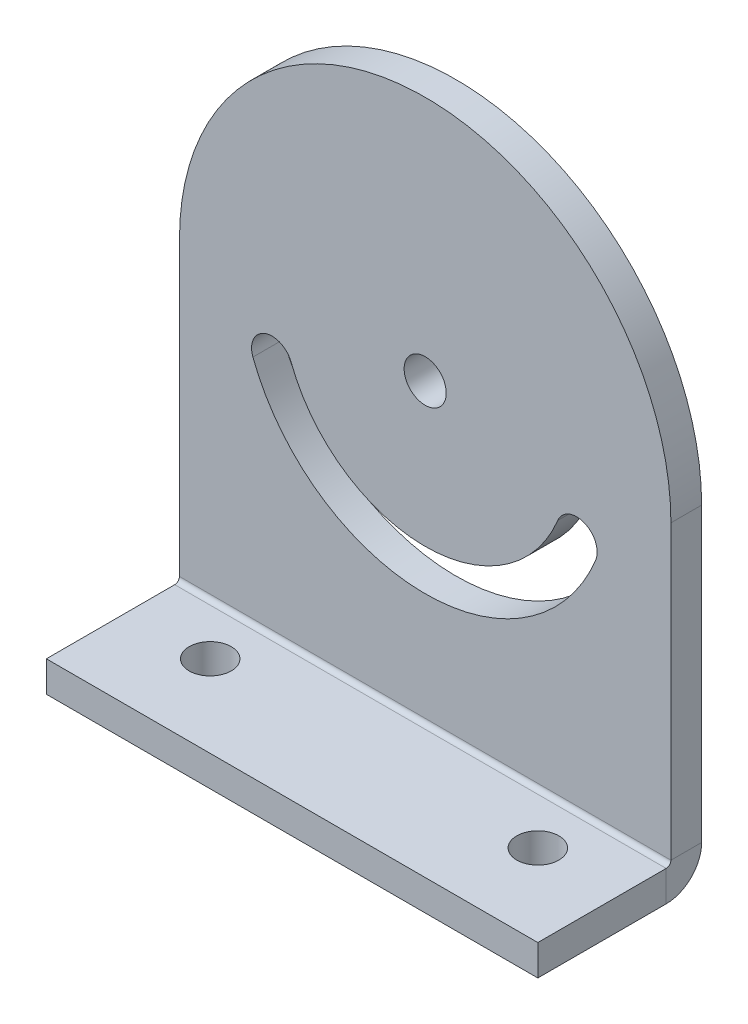
ISO-10303-21;
HEADER;
FILE_DESCRIPTION(('STEP AP214'),'2;1');
FILE_NAME('part.step','',(''),(''),'','','');
FILE_SCHEMA(('AUTOMOTIVE_DESIGN { 1 0 10303 214 1 1 1 1 }'));
ENDSEC;
DATA;
#1=APPLICATION_CONTEXT('core data for automotive mechanical design processes');
#2=APPLICATION_PROTOCOL_DEFINITION('international standard','automotive_design',2000,#1);
#3=PRODUCT_CONTEXT('',#1,'mechanical');
#4=PRODUCT('Part','Part','',(#3));
#5=PRODUCT_RELATED_PRODUCT_CATEGORY('part','',(#4));
#6=PRODUCT_DEFINITION_FORMATION('','',#4);
#7=PRODUCT_DEFINITION_CONTEXT('part definition',#1,'design');
#8=PRODUCT_DEFINITION('design','',#6,#7);
#9=PRODUCT_DEFINITION_SHAPE('','',#8);
#10=(LENGTH_UNIT() NAMED_UNIT(*) SI_UNIT(.MILLI.,.METRE.));
#11=(NAMED_UNIT(*) PLANE_ANGLE_UNIT() SI_UNIT($,.RADIAN.));
#12=(NAMED_UNIT(*) SI_UNIT($,.STERADIAN.) SOLID_ANGLE_UNIT());
#13=UNCERTAINTY_MEASURE_WITH_UNIT(LENGTH_MEASURE(1.E-05),#10,'distance_accuracy_value','');
#14=(GEOMETRIC_REPRESENTATION_CONTEXT(3) GLOBAL_UNCERTAINTY_ASSIGNED_CONTEXT((#13)) GLOBAL_UNIT_ASSIGNED_CONTEXT((#10,
#11,#12)) REPRESENTATION_CONTEXT('',''));
#15=CARTESIAN_POINT('',(0.,0.,0.));
#16=DIRECTION('',(0.,0.,1.));
#17=DIRECTION('',(1.,0.,0.));
#18=AXIS2_PLACEMENT_3D('',#15,#16,#17);
#19=CARTESIAN_POINT('',(0.,0.,-4.7625));
#20=DIRECTION('',(1.,0.,0.));
#21=DIRECTION('',(0.,1.,0.));
#22=AXIS2_PLACEMENT_3D('',#19,#20,#21);
#23=PLANE('',#22);
#24=DIRECTION('',(0.,1.,0.));
#25=VECTOR('',#24,1.);
#26=CARTESIAN_POINT('',(0.,0.,0.));
#27=LINE('',#26,#25);
#28=CARTESIAN_POINT('',(0.,-45.3009,0.));
#29=VERTEX_POINT('',#28);
#30=CARTESIAN_POINT('',(0.,0.,0.));
#31=VERTEX_POINT('',#30);
#32=EDGE_CURVE('E260',#29,#31,#27,.T.);
#33=ORIENTED_EDGE('',*,*,#32,.F.);
#34=DIRECTION('',(0.,0.,-1.));
#35=VECTOR('',#34,1.);
#36=CARTESIAN_POINT('',(0.,-45.3009,0.));
#37=LINE('',#36,#35);
#38=CARTESIAN_POINT('',(0.,-45.3009,-4.76250000000001));
#39=VERTEX_POINT('',#38);
#40=EDGE_CURVE('E239',#29,#39,#37,.T.);
#41=ORIENTED_EDGE('',*,*,#40,.T.);
#42=DIRECTION('',(0.,1.,0.));
#43=VECTOR('',#42,1.);
#44=CARTESIAN_POINT('',(0.,0.,-4.7625));
#45=LINE('',#44,#43);
#46=CARTESIAN_POINT('',(0.,0.,-4.7625));
#47=VERTEX_POINT('',#46);
#48=EDGE_CURVE('E263',#39,#47,#45,.T.);
#49=ORIENTED_EDGE('',*,*,#48,.T.);
#50=DIRECTION('',(0.,0.,1.));
#51=VECTOR('',#50,1.);
#52=CARTESIAN_POINT('',(0.,0.,-4.7625));
#53=LINE('',#52,#51);
#54=EDGE_CURVE('E13',#47,#31,#53,.T.);
#55=ORIENTED_EDGE('',*,*,#54,.T.);
#56=EDGE_LOOP('',(#33,#41,#49,#55));
#57=FACE_BOUND('',#56,.T.);
#58=ADVANCED_FACE('F59',(#57),#23,.T.);
#59=CARTESIAN_POINT('',(-38.1,0.,-4.7625));
#60=DIRECTION('',(0.,0.,1.));
#61=DIRECTION('',(1.,0.,0.));
#62=AXIS2_PLACEMENT_3D('',#59,#60,#61);
#63=PLANE('',#62);
#64=CARTESIAN_POINT('',(-38.1,0.,-4.76250000000001));
#65=DIRECTION('',(0.,0.,-1.));
#66=DIRECTION('',(1.,0.,0.));
#67=AXIS2_PLACEMENT_3D('',#64,#65,#66);
#68=CIRCLE('',#67,22.225);
#69=CARTESIAN_POINT('',(-17.5464100212601,-8.45580061176,-4.76250000000001));
#70=VERTEX_POINT('',#69);
#71=CARTESIAN_POINT('',(-58.8758877781445,-7.89386546819408,-4.76250000000001));
#72=VERTEX_POINT('',#71);
#73=EDGE_CURVE('E156',#70,#72,#68,.T.);
#74=ORIENTED_EDGE('',*,*,#73,.T.);
#75=CARTESIAN_POINT('',(-61.8438717464508,-9.02156053507896,-4.76250000000001));
#76=DIRECTION('',(0.,0.,1.));
#77=DIRECTION('',(1.,0.,0.));
#78=AXIS2_PLACEMENT_3D('',#75,#76,#77);
#79=CIRCLE('',#78,3.17500000000001);
#80=CARTESIAN_POINT('',(-64.8118557147572,-10.1492556019638,-4.76250000000001));
#81=VERTEX_POINT('',#80);
#82=EDGE_CURVE('E150',#72,#81,#79,.T.);
#83=ORIENTED_EDGE('',*,*,#82,.T.);
#84=CARTESIAN_POINT('',(-38.1,0.,-4.76250000000001));
#85=DIRECTION('',(0.,0.,1.));
#86=DIRECTION('',(1.,0.,0.));
#87=AXIS2_PLACEMENT_3D('',#84,#85,#86);
#88=CIRCLE('',#87,28.575);
#89=CARTESIAN_POINT('',(-11.6739557416201,-10.8717436436914,-4.7625));
#90=VERTEX_POINT('',#89);
#91=EDGE_CURVE('E159',#81,#90,#88,.T.);
#92=ORIENTED_EDGE('',*,*,#91,.T.);
#93=CARTESIAN_POINT('',(-14.6101828814401,-9.66377212772572,-4.76250000000001));
#94=DIRECTION('',(0.,0.,1.));
#95=DIRECTION('',(1.,0.,0.));
#96=AXIS2_PLACEMENT_3D('',#93,#94,#95);
#97=CIRCLE('',#96,3.175);
#98=EDGE_CURVE('E74',#90,#70,#97,.T.);
#99=ORIENTED_EDGE('',*,*,#98,.T.);
#100=EDGE_LOOP('',(#74,#83,#92,#99));
#101=FACE_BOUND('',#100,.T.);
#102=CARTESIAN_POINT('',(-38.1,0.,-4.7625));
#103=DIRECTION('',(0.,0.,1.));
#104=DIRECTION('',(1.,0.,0.));
#105=AXIS2_PLACEMENT_3D('',#102,#103,#104);
#106=CIRCLE('',#105,3.2639);
#107=CARTESIAN_POINT('',(-34.8361,0.,-4.7625));
#108=VERTEX_POINT('',#107);
#109=EDGE_CURVE('E187',#108,#108,#106,.T.);
#110=ORIENTED_EDGE('',*,*,#109,.T.);
#111=EDGE_LOOP('',(#110));
#112=FACE_BOUND('',#111,.T.);
#113=DIRECTION('',(1.,0.,0.));
#114=VECTOR('',#113,1.);
#115=CARTESIAN_POINT('',(0.,-45.3009,-4.76250000000001));
#116=LINE('',#115,#114);
#117=CARTESIAN_POINT('',(-76.2,-45.3009,-4.7625));
#118=VERTEX_POINT('',#117);
#119=EDGE_CURVE('E233',#39,#118,#116,.F.);
#120=ORIENTED_EDGE('',*,*,#119,.T.);
#121=DIRECTION('',(0.,-1.,0.));
#122=VECTOR('',#121,1.);
#123=CARTESIAN_POINT('',(-76.2,-50.8,-4.7625));
#124=LINE('',#123,#122);
#125=CARTESIAN_POINT('',(-76.2,0.,-4.7625));
#126=VERTEX_POINT('',#125);
#127=EDGE_CURVE('E259',#126,#118,#124,.T.);
#128=ORIENTED_EDGE('',*,*,#127,.F.);
#129=CARTESIAN_POINT('',(-38.1,0.,-4.7625));
#130=DIRECTION('',(0.,0.,1.));
#131=DIRECTION('',(1.,0.,0.));
#132=AXIS2_PLACEMENT_3D('',#129,#130,#131);
#133=CIRCLE('',#132,38.1);
#134=EDGE_CURVE('E256',#47,#126,#133,.T.);
#135=ORIENTED_EDGE('',*,*,#134,.F.);
#136=ORIENTED_EDGE('',*,*,#48,.F.);
#137=EDGE_LOOP('',(#120,#128,#135,#136));
#138=FACE_BOUND('',#137,.T.);
#139=ADVANCED_FACE('F163',(#101,#112,#138),#63,.F.);
#140=CARTESIAN_POINT('',(-38.1,0.,0.));
#141=DIRECTION('',(0.,0.,1.));
#142=DIRECTION('',(1.,0.,0.));
#143=AXIS2_PLACEMENT_3D('',#140,#141,#142);
#144=PLANE('',#143);
#145=CARTESIAN_POINT('',(-61.8438717464508,-9.02156053507896,0.));
#146=DIRECTION('',(0.,0.,1.));
#147=DIRECTION('',(1.,0.,0.));
#148=AXIS2_PLACEMENT_3D('',#145,#146,#147);
#149=CIRCLE('',#148,3.17500000000001);
#150=CARTESIAN_POINT('',(-58.8758877781445,-7.89386546819408,0.));
#151=VERTEX_POINT('',#150);
#152=CARTESIAN_POINT('',(-64.8118557147572,-10.1492556019638,0.));
#153=VERTEX_POINT('',#152);
#154=EDGE_CURVE('E82',#151,#153,#149,.T.);
#155=ORIENTED_EDGE('',*,*,#154,.F.);
#156=CARTESIAN_POINT('',(-38.1,0.,0.));
#157=DIRECTION('',(0.,0.,-1.));
#158=DIRECTION('',(1.,0.,0.));
#159=AXIS2_PLACEMENT_3D('',#156,#157,#158);
#160=CIRCLE('',#159,22.225);
#161=CARTESIAN_POINT('',(-17.5464100212601,-8.45580061176,0.));
#162=VERTEX_POINT('',#161);
#163=EDGE_CURVE('E166',#162,#151,#160,.T.);
#164=ORIENTED_EDGE('',*,*,#163,.F.);
#165=CARTESIAN_POINT('',(-14.6101828814401,-9.66377212772572,0.));
#166=DIRECTION('',(0.,0.,1.));
#167=DIRECTION('',(1.,0.,0.));
#168=AXIS2_PLACEMENT_3D('',#165,#166,#167);
#169=CIRCLE('',#168,3.175);
#170=CARTESIAN_POINT('',(-11.6739557416201,-10.8717436436914,0.));
#171=VERTEX_POINT('',#170);
#172=EDGE_CURVE('E169',#171,#162,#169,.T.);
#173=ORIENTED_EDGE('',*,*,#172,.F.);
#174=CARTESIAN_POINT('',(-38.1,0.,0.));
#175=DIRECTION('',(0.,0.,1.));
#176=DIRECTION('',(1.,0.,0.));
#177=AXIS2_PLACEMENT_3D('',#174,#175,#176);
#178=CIRCLE('',#177,28.575);
#179=EDGE_CURVE('E175',#153,#171,#178,.T.);
#180=ORIENTED_EDGE('',*,*,#179,.F.);
#181=EDGE_LOOP('',(#155,#164,#173,#180));
#182=FACE_BOUND('',#181,.T.);
#183=CARTESIAN_POINT('',(-38.1,0.,0.));
#184=DIRECTION('',(0.,0.,1.));
#185=DIRECTION('',(1.,0.,0.));
#186=AXIS2_PLACEMENT_3D('',#183,#184,#185);
#187=CIRCLE('',#186,3.26389999999999);
#188=CARTESIAN_POINT('',(-34.8361,0.,0.));
#189=VERTEX_POINT('',#188);
#190=EDGE_CURVE('E181',#189,#189,#187,.T.);
#191=ORIENTED_EDGE('',*,*,#190,.F.);
#192=EDGE_LOOP('',(#191));
#193=FACE_BOUND('',#192,.T.);
#194=DIRECTION('',(0.,-1.,0.));
#195=VECTOR('',#194,1.);
#196=CARTESIAN_POINT('',(-76.2,-50.8,0.));
#197=LINE('',#196,#195);
#198=CARTESIAN_POINT('',(-76.2,0.,0.));
#199=VERTEX_POINT('',#198);
#200=CARTESIAN_POINT('',(-76.2,-45.3009,0.));
#201=VERTEX_POINT('',#200);
#202=EDGE_CURVE('E267',#199,#201,#197,.T.);
#203=ORIENTED_EDGE('',*,*,#202,.T.);
#204=DIRECTION('',(1.,0.,0.));
#205=VECTOR('',#204,1.);
#206=CARTESIAN_POINT('',(0.,-45.3009,0.));
#207=LINE('',#206,#205);
#208=EDGE_CURVE('E245',#29,#201,#207,.F.);
#209=ORIENTED_EDGE('',*,*,#208,.F.);
#210=ORIENTED_EDGE('',*,*,#32,.T.);
#211=CARTESIAN_POINT('',(-38.1,0.,0.));
#212=DIRECTION('',(0.,0.,1.));
#213=DIRECTION('',(1.,0.,0.));
#214=AXIS2_PLACEMENT_3D('',#211,#212,#213);
#215=CIRCLE('',#214,38.1);
#216=EDGE_CURVE('E253',#31,#199,#215,.T.);
#217=ORIENTED_EDGE('',*,*,#216,.T.);
#218=EDGE_LOOP('',(#203,#209,#210,#217));
#219=FACE_BOUND('',#218,.T.);
#220=ADVANCED_FACE('F272',(#182,#193,#219),#144,.T.);
#221=CARTESIAN_POINT('',(-38.1,0.,-4.7625));
#222=DIRECTION('',(0.,0.,1.));
#223=DIRECTION('',(1.,0.,0.));
#224=AXIS2_PLACEMENT_3D('',#221,#222,#223);
#225=CYLINDRICAL_SURFACE('',#224,38.1);
#226=ORIENTED_EDGE('',*,*,#216,.F.);
#227=ORIENTED_EDGE('',*,*,#54,.F.);
#228=ORIENTED_EDGE('',*,*,#134,.T.);
#229=DIRECTION('',(0.,0.,1.));
#230=VECTOR('',#229,1.);
#231=CARTESIAN_POINT('',(-76.2,0.,-4.7625));
#232=LINE('',#231,#230);
#233=EDGE_CURVE('E63',#126,#199,#232,.T.);
#234=ORIENTED_EDGE('',*,*,#233,.T.);
#235=EDGE_LOOP('',(#226,#227,#228,#234));
#236=FACE_BOUND('',#235,.T.);
#237=ADVANCED_FACE('F61',(#236),#225,.T.);
#238=CARTESIAN_POINT('',(-76.2,-50.8,-4.7625));
#239=DIRECTION('',(-1.,0.,0.));
#240=DIRECTION('',(0.,-1.,0.));
#241=AXIS2_PLACEMENT_3D('',#238,#239,#240);
#242=PLANE('',#241);
#243=DIRECTION('',(0.,0.,-1.));
#244=VECTOR('',#243,1.);
#245=CARTESIAN_POINT('',(-76.2,-45.3009,0.));
#246=LINE('',#245,#244);
#247=EDGE_CURVE('E250',#201,#118,#246,.T.);
#248=ORIENTED_EDGE('',*,*,#247,.F.);
#249=ORIENTED_EDGE('',*,*,#202,.F.);
#250=ORIENTED_EDGE('',*,*,#233,.F.);
#251=ORIENTED_EDGE('',*,*,#127,.T.);
#252=EDGE_LOOP('',(#248,#249,#250,#251));
#253=FACE_BOUND('',#252,.T.);
#254=ADVANCED_FACE('F282',(#253),#242,.T.);
#255=CARTESIAN_POINT('',(-76.2,-45.3009,0.7366));
#256=DIRECTION('',(-1.,0.,0.));
#257=DIRECTION('',(0.,0.,1.));
#258=AXIS2_PLACEMENT_3D('',#255,#256,#257);
#259=PLANE('',#258);
#260=DIRECTION('',(0.,1.,0.));
#261=VECTOR('',#260,1.);
#262=CARTESIAN_POINT('',(-76.2,-50.8,0.736599999999981));
#263=LINE('',#262,#261);
#264=CARTESIAN_POINT('',(-76.2,-46.0375,0.736599999999997));
#265=VERTEX_POINT('',#264);
#266=CARTESIAN_POINT('',(-76.2,-50.8,0.736599999999981));
#267=VERTEX_POINT('',#266);
#268=EDGE_CURVE('E202',#265,#267,#263,.F.);
#269=ORIENTED_EDGE('',*,*,#268,.F.);
#270=CARTESIAN_POINT('',(-76.2,-45.3009,0.7366));
#271=DIRECTION('',(1.,0.,0.));
#272=DIRECTION('',(0.,0.,-1.));
#273=AXIS2_PLACEMENT_3D('',#270,#271,#272);
#274=CIRCLE('',#273,0.736600000000011);
#275=EDGE_CURVE('E242',#201,#265,#274,.F.);
#276=ORIENTED_EDGE('',*,*,#275,.F.);
#277=ORIENTED_EDGE('',*,*,#247,.T.);
#278=CARTESIAN_POINT('',(-76.2,-45.3009,0.7366));
#279=DIRECTION('',(1.,0.,0.));
#280=DIRECTION('',(0.,0.,-1.));
#281=AXIS2_PLACEMENT_3D('',#278,#279,#280);
#282=CIRCLE('',#281,5.49910000000001);
#283=EDGE_CURVE('E235',#118,#267,#282,.F.);
#284=ORIENTED_EDGE('',*,*,#283,.T.);
#285=EDGE_LOOP('',(#269,#276,#277,#284));
#286=FACE_BOUND('',#285,.T.);
#287=ADVANCED_FACE('F289',(#286),#259,.T.);
#288=CARTESIAN_POINT('',(0.,-45.3009,0.736600000000006));
#289=DIRECTION('',(-1.,0.,0.));
#290=DIRECTION('',(0.,0.,1.));
#291=AXIS2_PLACEMENT_3D('',#288,#289,#290);
#292=PLANE('',#291);
#293=CARTESIAN_POINT('',(0.,-45.3009,0.736600000000006));
#294=DIRECTION('',(1.,0.,0.));
#295=DIRECTION('',(0.,0.,-1.));
#296=AXIS2_PLACEMENT_3D('',#293,#294,#295);
#297=CIRCLE('',#296,0.736600000000011);
#298=CARTESIAN_POINT('',(0.,-46.0375,0.736600000000003));
#299=VERTEX_POINT('',#298);
#300=EDGE_CURVE('E206',#299,#29,#297,.T.);
#301=ORIENTED_EDGE('',*,*,#300,.F.);
#302=DIRECTION('',(0.,1.,0.));
#303=VECTOR('',#302,1.);
#304=CARTESIAN_POINT('',(0.,-46.0375,0.736600000000004));
#305=LINE('',#304,#303);
#306=CARTESIAN_POINT('',(0.,-50.8,0.736599999999988));
#307=VERTEX_POINT('',#306);
#308=EDGE_CURVE('E226',#299,#307,#305,.F.);
#309=ORIENTED_EDGE('',*,*,#308,.T.);
#310=CARTESIAN_POINT('',(0.,-45.3009,0.736600000000006));
#311=DIRECTION('',(1.,0.,0.));
#312=DIRECTION('',(0.,0.,-1.));
#313=AXIS2_PLACEMENT_3D('',#310,#311,#312);
#314=CIRCLE('',#313,5.49910000000001);
#315=EDGE_CURVE('E236',#307,#39,#314,.T.);
#316=ORIENTED_EDGE('',*,*,#315,.T.);
#317=ORIENTED_EDGE('',*,*,#40,.F.);
#318=EDGE_LOOP('',(#301,#309,#316,#317));
#319=FACE_BOUND('',#318,.T.);
#320=ADVANCED_FACE('F310',(#319),#292,.F.);
#321=CARTESIAN_POINT('',(0.,-45.3009,0.736600000000006));
#322=DIRECTION('',(1.,0.,0.));
#323=DIRECTION('',(0.,-1.,0.));
#324=AXIS2_PLACEMENT_3D('',#321,#322,#323);
#325=CYLINDRICAL_SURFACE('',#324,5.49910000000001);
#326=ORIENTED_EDGE('',*,*,#119,.F.);
#327=ORIENTED_EDGE('',*,*,#315,.F.);
#328=DIRECTION('',(1.,0.,0.));
#329=VECTOR('',#328,1.);
#330=CARTESIAN_POINT('',(-76.2,-50.8,0.736599999999981));
#331=LINE('',#330,#329);
#332=EDGE_CURVE('E224',#307,#267,#331,.F.);
#333=ORIENTED_EDGE('',*,*,#332,.T.);
#334=ORIENTED_EDGE('',*,*,#283,.F.);
#335=EDGE_LOOP('',(#326,#327,#333,#334));
#336=FACE_BOUND('',#335,.T.);
#337=ADVANCED_FACE('F320',(#336),#325,.T.);
#338=CARTESIAN_POINT('',(0.,-45.3009,0.736600000000006));
#339=DIRECTION('',(1.,0.,0.));
#340=DIRECTION('',(0.,-1.,0.));
#341=AXIS2_PLACEMENT_3D('',#338,#339,#340);
#342=CYLINDRICAL_SURFACE('',#341,0.736600000000011);
#343=ORIENTED_EDGE('',*,*,#208,.T.);
#344=ORIENTED_EDGE('',*,*,#275,.T.);
#345=DIRECTION('',(1.,0.,0.));
#346=VECTOR('',#345,1.);
#347=CARTESIAN_POINT('',(-76.2,-46.0375,0.736599999999997));
#348=LINE('',#347,#346);
#349=EDGE_CURVE('E229',#265,#299,#348,.T.);
#350=ORIENTED_EDGE('',*,*,#349,.T.);
#351=ORIENTED_EDGE('',*,*,#300,.T.);
#352=EDGE_LOOP('',(#343,#344,#350,#351));
#353=FACE_BOUND('',#352,.T.);
#354=ADVANCED_FACE('F285',(#353),#342,.F.);
#355=CARTESIAN_POINT('',(0.,-50.8000000000001,20.6375));
#356=DIRECTION('',(-1.,0.,0.));
#357=DIRECTION('',(0.,0.,1.));
#358=AXIS2_PLACEMENT_3D('',#355,#356,#357);
#359=PLANE('',#358);
#360=ORIENTED_EDGE('',*,*,#308,.F.);
#361=DIRECTION('',(0.,0.,-1.));
#362=VECTOR('',#361,1.);
#363=CARTESIAN_POINT('',(0.,-46.0375000000001,20.6375));
#364=LINE('',#363,#362);
#365=CARTESIAN_POINT('',(0.,-46.0375000000001,20.6375));
#366=VERTEX_POINT('',#365);
#367=EDGE_CURVE('E222',#299,#366,#364,.F.);
#368=ORIENTED_EDGE('',*,*,#367,.T.);
#369=DIRECTION('',(0.,1.,0.));
#370=VECTOR('',#369,1.);
#371=CARTESIAN_POINT('',(0.,-50.8000000000001,20.6375));
#372=LINE('',#371,#370);
#373=CARTESIAN_POINT('',(0.,-50.8000000000001,20.6375));
#374=VERTEX_POINT('',#373);
#375=EDGE_CURVE('E203',#374,#366,#372,.T.);
#376=ORIENTED_EDGE('',*,*,#375,.F.);
#377=DIRECTION('',(0.,0.,1.));
#378=VECTOR('',#377,1.);
#379=CARTESIAN_POINT('',(0.,-50.8,-1.87431722126264E-13));
#380=LINE('',#379,#378);
#381=EDGE_CURVE('E215',#307,#374,#380,.T.);
#382=ORIENTED_EDGE('',*,*,#381,.F.);
#383=EDGE_LOOP('',(#360,#368,#376,#382));
#384=FACE_BOUND('',#383,.T.);
#385=ADVANCED_FACE('F312',(#384),#359,.F.);
#386=CARTESIAN_POINT('',(-76.2,-50.8,0.));
#387=DIRECTION('',(1.,0.,0.));
#388=DIRECTION('',(0.,0.,-1.));
#389=AXIS2_PLACEMENT_3D('',#386,#387,#388);
#390=PLANE('',#389);
#391=ORIENTED_EDGE('',*,*,#268,.T.);
#392=DIRECTION('',(0.,0.,-1.));
#393=VECTOR('',#392,1.);
#394=CARTESIAN_POINT('',(-76.2,-50.8,-3.92395972826293E-13));
#395=LINE('',#394,#393);
#396=CARTESIAN_POINT('',(-76.2,-50.8000000000001,20.6375));
#397=VERTEX_POINT('',#396);
#398=EDGE_CURVE('E210',#397,#267,#395,.T.);
#399=ORIENTED_EDGE('',*,*,#398,.F.);
#400=DIRECTION('',(0.,1.,0.));
#401=VECTOR('',#400,1.);
#402=CARTESIAN_POINT('',(-76.2,-50.8000000000001,20.6375));
#403=LINE('',#402,#401);
#404=CARTESIAN_POINT('',(-76.2,-46.0375000000001,20.6375));
#405=VERTEX_POINT('',#404);
#406=EDGE_CURVE('E207',#397,#405,#403,.T.);
#407=ORIENTED_EDGE('',*,*,#406,.T.);
#408=DIRECTION('',(0.,0.,1.));
#409=VECTOR('',#408,1.);
#410=CARTESIAN_POINT('',(-76.2,-46.0375,0.));
#411=LINE('',#410,#409);
#412=EDGE_CURVE('E217',#405,#265,#411,.F.);
#413=ORIENTED_EDGE('',*,*,#412,.T.);
#414=EDGE_LOOP('',(#391,#399,#407,#413));
#415=FACE_BOUND('',#414,.T.);
#416=ADVANCED_FACE('F293',(#415),#390,.F.);
#417=CARTESIAN_POINT('',(0.,-50.8,-1.87431722126264E-13));
#418=DIRECTION('',(0.,1.,0.));
#419=DIRECTION('',(0.,0.,1.));
#420=AXIS2_PLACEMENT_3D('',#417,#418,#419);
#421=PLANE('',#420);
#422=CARTESIAN_POINT('',(-63.5,-50.8000000000001,7.93750000000009));
#423=DIRECTION('',(0.,1.,0.));
#424=DIRECTION('',(0.,0.,1.));
#425=AXIS2_PLACEMENT_3D('',#422,#423,#424);
#426=CIRCLE('',#425,3.2639);
#427=CARTESIAN_POINT('',(-63.5,-50.8000000000001,11.2014000000001));
#428=VERTEX_POINT('',#427);
#429=EDGE_CURVE('E193',#428,#428,#426,.T.);
#430=ORIENTED_EDGE('',*,*,#429,.T.);
#431=EDGE_LOOP('',(#430));
#432=FACE_BOUND('',#431,.T.);
#433=CARTESIAN_POINT('',(-12.7,-50.8000000000001,7.93750000000009));
#434=DIRECTION('',(0.,1.,0.));
#435=DIRECTION('',(0.,0.,1.));
#436=AXIS2_PLACEMENT_3D('',#433,#434,#435);
#437=CIRCLE('',#436,3.2639);
#438=CARTESIAN_POINT('',(-12.7,-50.8000000000001,11.2014000000001));
#439=VERTEX_POINT('',#438);
#440=EDGE_CURVE('E199',#439,#439,#437,.T.);
#441=ORIENTED_EDGE('',*,*,#440,.T.);
#442=EDGE_LOOP('',(#441));
#443=FACE_BOUND('',#442,.T.);
#444=ORIENTED_EDGE('',*,*,#332,.F.);
#445=ORIENTED_EDGE('',*,*,#381,.T.);
#446=DIRECTION('',(-1.,0.,0.));
#447=VECTOR('',#446,1.);
#448=CARTESIAN_POINT('',(0.,-50.8000000000001,20.6375));
#449=LINE('',#448,#447);
#450=EDGE_CURVE('E213',#374,#397,#449,.T.);
#451=ORIENTED_EDGE('',*,*,#450,.T.);
#452=ORIENTED_EDGE('',*,*,#398,.T.);
#453=EDGE_LOOP('',(#444,#445,#451,#452));
#454=FACE_BOUND('',#453,.T.);
#455=ADVANCED_FACE('F297',(#432,#443,#454),#421,.F.);
#456=CARTESIAN_POINT('',(0.,-46.0375,-1.70803542250024E-13));
#457=DIRECTION('',(0.,1.,0.));
#458=DIRECTION('',(0.,0.,1.));
#459=AXIS2_PLACEMENT_3D('',#456,#457,#458);
#460=PLANE('',#459);
#461=CARTESIAN_POINT('',(-63.5,-46.0375,7.9375000000001));
#462=DIRECTION('',(0.,1.,0.));
#463=DIRECTION('',(0.,0.,1.));
#464=AXIS2_PLACEMENT_3D('',#461,#462,#463);
#465=CIRCLE('',#464,3.26389999999999);
#466=CARTESIAN_POINT('',(-63.5,-46.0375,11.2014000000001));
#467=VERTEX_POINT('',#466);
#468=EDGE_CURVE('E190',#467,#467,#465,.T.);
#469=ORIENTED_EDGE('',*,*,#468,.F.);
#470=EDGE_LOOP('',(#469));
#471=FACE_BOUND('',#470,.T.);
#472=CARTESIAN_POINT('',(-12.7,-46.0375,7.9375000000001));
#473=DIRECTION('',(0.,1.,0.));
#474=DIRECTION('',(0.,0.,1.));
#475=AXIS2_PLACEMENT_3D('',#472,#473,#474);
#476=CIRCLE('',#475,3.26389999999999);
#477=CARTESIAN_POINT('',(-12.7,-46.0375,11.2014000000001));
#478=VERTEX_POINT('',#477);
#479=EDGE_CURVE('E196',#478,#478,#476,.T.);
#480=ORIENTED_EDGE('',*,*,#479,.F.);
#481=EDGE_LOOP('',(#480));
#482=FACE_BOUND('',#481,.T.);
#483=ORIENTED_EDGE('',*,*,#367,.F.);
#484=ORIENTED_EDGE('',*,*,#349,.F.);
#485=ORIENTED_EDGE('',*,*,#412,.F.);
#486=DIRECTION('',(1.,0.,0.));
#487=VECTOR('',#486,1.);
#488=CARTESIAN_POINT('',(-76.2,-46.0375000000001,20.6375));
#489=LINE('',#488,#487);
#490=EDGE_CURVE('E220',#366,#405,#489,.F.);
#491=ORIENTED_EDGE('',*,*,#490,.F.);
#492=EDGE_LOOP('',(#483,#484,#485,#491));
#493=FACE_BOUND('',#492,.T.);
#494=ADVANCED_FACE('F307',(#471,#482,#493),#460,.T.);
#495=CARTESIAN_POINT('',(-76.2,-50.8000000000001,20.6375));
#496=DIRECTION('',(0.,0.,-1.));
#497=DIRECTION('',(0.,1.,0.));
#498=AXIS2_PLACEMENT_3D('',#495,#496,#497);
#499=PLANE('',#498);
#500=ORIENTED_EDGE('',*,*,#490,.T.);
#501=ORIENTED_EDGE('',*,*,#406,.F.);
#502=ORIENTED_EDGE('',*,*,#450,.F.);
#503=ORIENTED_EDGE('',*,*,#375,.T.);
#504=EDGE_LOOP('',(#500,#501,#502,#503));
#505=FACE_BOUND('',#504,.T.);
#506=ADVANCED_FACE('F303',(#505),#499,.F.);
#507=CARTESIAN_POINT('',(-12.7,-46.0375,7.9375000000001));
#508=DIRECTION('',(0.,1.,0.));
#509=DIRECTION('',(0.,0.,1.));
#510=AXIS2_PLACEMENT_3D('',#507,#508,#509);
#511=CYLINDRICAL_SURFACE('',#510,3.26389999999999);
#512=ORIENTED_EDGE('',*,*,#440,.F.);
#513=EDGE_LOOP('',(#512));
#514=FACE_BOUND('',#513,.T.);
#515=ORIENTED_EDGE('',*,*,#479,.T.);
#516=EDGE_LOOP('',(#515));
#517=FACE_BOUND('',#516,.T.);
#518=ADVANCED_FACE('F358',(#514,#517),#511,.F.);
#519=CARTESIAN_POINT('',(-63.5,-46.0375,7.9375000000001));
#520=DIRECTION('',(0.,1.,0.));
#521=DIRECTION('',(0.,0.,1.));
#522=AXIS2_PLACEMENT_3D('',#519,#520,#521);
#523=CYLINDRICAL_SURFACE('',#522,3.26389999999999);
#524=ORIENTED_EDGE('',*,*,#429,.F.);
#525=EDGE_LOOP('',(#524));
#526=FACE_BOUND('',#525,.T.);
#527=ORIENTED_EDGE('',*,*,#468,.T.);
#528=EDGE_LOOP('',(#527));
#529=FACE_BOUND('',#528,.T.);
#530=ADVANCED_FACE('F349',(#526,#529),#523,.F.);
#531=CARTESIAN_POINT('',(-38.1,0.,0.));
#532=DIRECTION('',(0.,0.,1.));
#533=DIRECTION('',(1.,0.,0.));
#534=AXIS2_PLACEMENT_3D('',#531,#532,#533);
#535=CYLINDRICAL_SURFACE('',#534,3.26389999999999);
#536=ORIENTED_EDGE('',*,*,#109,.F.);
#537=EDGE_LOOP('',(#536));
#538=FACE_BOUND('',#537,.T.);
#539=ORIENTED_EDGE('',*,*,#190,.T.);
#540=EDGE_LOOP('',(#539));
#541=FACE_BOUND('',#540,.T.);
#542=ADVANCED_FACE('F347',(#538,#541),#535,.F.);
#543=CARTESIAN_POINT('',(-61.8438717464508,-9.02156053507896,-4.76250000000001));
#544=DIRECTION('',(0.,0.,1.));
#545=DIRECTION('',(1.,0.,0.));
#546=AXIS2_PLACEMENT_3D('',#543,#544,#545);
#547=CYLINDRICAL_SURFACE('',#546,3.17500000000001);
#548=ORIENTED_EDGE('',*,*,#154,.T.);
#549=DIRECTION('',(0.,0.,1.));
#550=VECTOR('',#549,1.);
#551=CARTESIAN_POINT('',(-64.8118557147572,-10.1492556019638,-4.76250000000001));
#552=LINE('',#551,#550);
#553=EDGE_CURVE('E146',#81,#153,#552,.T.);
#554=ORIENTED_EDGE('',*,*,#553,.F.);
#555=ORIENTED_EDGE('',*,*,#82,.F.);
#556=DIRECTION('',(0.,0.,1.));
#557=VECTOR('',#556,1.);
#558=CARTESIAN_POINT('',(-58.8758877781445,-7.89386546819408,-4.76250000000001));
#559=LINE('',#558,#557);
#560=EDGE_CURVE('E179',#72,#151,#559,.T.);
#561=ORIENTED_EDGE('',*,*,#560,.T.);
#562=EDGE_LOOP('',(#548,#554,#555,#561));
#563=FACE_BOUND('',#562,.T.);
#564=ADVANCED_FACE('F148',(#563),#547,.F.);
#565=CARTESIAN_POINT('',(-38.1,0.,-4.76250000000001));
#566=DIRECTION('',(0.,0.,1.));
#567=DIRECTION('',(1.,0.,0.));
#568=AXIS2_PLACEMENT_3D('',#565,#566,#567);
#569=CYLINDRICAL_SURFACE('',#568,22.225);
#570=ORIENTED_EDGE('',*,*,#163,.T.);
#571=ORIENTED_EDGE('',*,*,#560,.F.);
#572=ORIENTED_EDGE('',*,*,#73,.F.);
#573=DIRECTION('',(0.,0.,1.));
#574=VECTOR('',#573,1.);
#575=CARTESIAN_POINT('',(-17.5464100212601,-8.45580061176,-4.76250000000001));
#576=LINE('',#575,#574);
#577=EDGE_CURVE('E182',#70,#162,#576,.T.);
#578=ORIENTED_EDGE('',*,*,#577,.T.);
#579=EDGE_LOOP('',(#570,#571,#572,#578));
#580=FACE_BOUND('',#579,.T.);
#581=ADVANCED_FACE('F356',(#580),#569,.T.);
#582=CARTESIAN_POINT('',(-14.6101828814401,-9.66377212772572,-4.76250000000001));
#583=DIRECTION('',(0.,0.,1.));
#584=DIRECTION('',(1.,0.,0.));
#585=AXIS2_PLACEMENT_3D('',#582,#583,#584);
#586=CYLINDRICAL_SURFACE('',#585,3.175);
#587=ORIENTED_EDGE('',*,*,#172,.T.);
#588=ORIENTED_EDGE('',*,*,#577,.F.);
#589=ORIENTED_EDGE('',*,*,#98,.F.);
#590=DIRECTION('',(0.,0.,1.));
#591=VECTOR('',#590,1.);
#592=CARTESIAN_POINT('',(-11.6739557416201,-10.8717436436914,-4.76250000000001));
#593=LINE('',#592,#591);
#594=EDGE_CURVE('E155',#90,#171,#593,.T.);
#595=ORIENTED_EDGE('',*,*,#594,.T.);
#596=EDGE_LOOP('',(#587,#588,#589,#595));
#597=FACE_BOUND('',#596,.T.);
#598=ADVANCED_FACE('F419',(#597),#586,.F.);
#599=CARTESIAN_POINT('',(-38.1,0.,-4.76250000000001));
#600=DIRECTION('',(0.,0.,1.));
#601=DIRECTION('',(1.,0.,0.));
#602=AXIS2_PLACEMENT_3D('',#599,#600,#601);
#603=CYLINDRICAL_SURFACE('',#602,28.575);
#604=ORIENTED_EDGE('',*,*,#179,.T.);
#605=ORIENTED_EDGE('',*,*,#594,.F.);
#606=ORIENTED_EDGE('',*,*,#91,.F.);
#607=ORIENTED_EDGE('',*,*,#553,.T.);
#608=EDGE_LOOP('',(#604,#605,#606,#607));
#609=FACE_BOUND('',#608,.T.);
#610=ADVANCED_FACE('F160',(#609),#603,.F.);
#611=CLOSED_SHELL('',(#58,#139,#220,#237,#254,#287,#320,#337,#354,#385,#416,#455,#494,#506,#518,
#530,#542,#564,#581,#598,#610));
#612=MANIFOLD_SOLID_BREP('B2',#611);
#613=ADVANCED_BREP_SHAPE_REPRESENTATION('',(#18,#612),#14);
#614=SHAPE_DEFINITION_REPRESENTATION(#9,#613);
ENDSEC;
END-ISO-10303-21;
